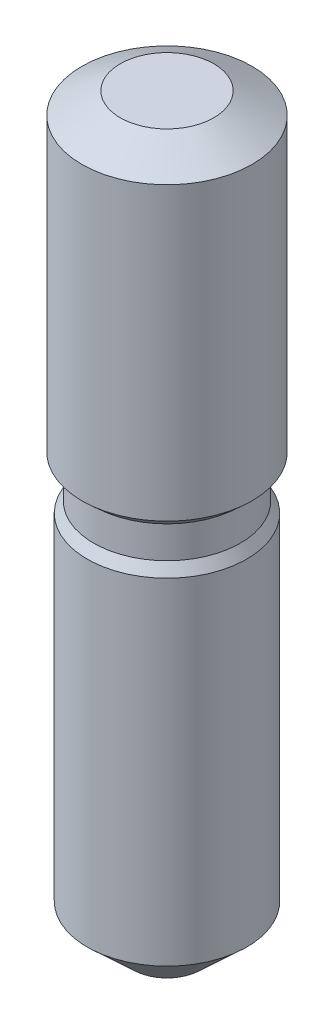
ISO-10303-21;
HEADER;
FILE_DESCRIPTION(('STEP AP214'),'2;1');
FILE_NAME('part.step','',(''),(''),'','','');
FILE_SCHEMA(('AUTOMOTIVE_DESIGN { 1 0 10303 214 1 1 1 1 }'));
ENDSEC;
DATA;
#1=APPLICATION_CONTEXT('core data for automotive mechanical design processes');
#2=APPLICATION_PROTOCOL_DEFINITION('international standard','automotive_design',2000,#1);
#3=PRODUCT_CONTEXT('',#1,'mechanical');
#4=PRODUCT('Part','Part','',(#3));
#5=PRODUCT_RELATED_PRODUCT_CATEGORY('part','',(#4));
#6=PRODUCT_DEFINITION_FORMATION('','',#4);
#7=PRODUCT_DEFINITION_CONTEXT('part definition',#1,'design');
#8=PRODUCT_DEFINITION('design','',#6,#7);
#9=PRODUCT_DEFINITION_SHAPE('','',#8);
#10=(LENGTH_UNIT() NAMED_UNIT(*) SI_UNIT(.MILLI.,.METRE.));
#11=(NAMED_UNIT(*) PLANE_ANGLE_UNIT() SI_UNIT($,.RADIAN.));
#12=(NAMED_UNIT(*) SI_UNIT($,.STERADIAN.) SOLID_ANGLE_UNIT());
#13=UNCERTAINTY_MEASURE_WITH_UNIT(LENGTH_MEASURE(1.E-05),#10,'distance_accuracy_value','');
#14=(GEOMETRIC_REPRESENTATION_CONTEXT(3) GLOBAL_UNCERTAINTY_ASSIGNED_CONTEXT((#13)) GLOBAL_UNIT_ASSIGNED_CONTEXT((#10,
#11,#12)) REPRESENTATION_CONTEXT('',''));
#15=CARTESIAN_POINT('',(0.,0.,0.));
#16=DIRECTION('',(0.,0.,1.));
#17=DIRECTION('',(1.,0.,0.));
#18=AXIS2_PLACEMENT_3D('',#15,#16,#17);
#19=CARTESIAN_POINT('',(0.,0.,0.));
#20=DIRECTION('',(0.,1.,0.));
#21=DIRECTION('',(0.,0.,1.));
#22=AXIS2_PLACEMENT_3D('',#19,#20,#21);
#23=PLANE('',#22);
#24=CARTESIAN_POINT('',(0.,0.,0.));
#25=DIRECTION('',(0.,-1.,0.));
#26=DIRECTION('',(0.,0.,-1.));
#27=AXIS2_PLACEMENT_3D('',#24,#25,#26);
#28=CIRCLE('',#27,4.4);
#29=CARTESIAN_POINT('',(0.,0.,-4.4));
#30=VERTEX_POINT('',#29);
#31=EDGE_CURVE('E10',#30,#30,#28,.T.);
#32=ORIENTED_EDGE('',*,*,#31,.F.);
#33=EDGE_LOOP('',(#32));
#34=FACE_BOUND('',#33,.T.);
#35=ADVANCED_FACE('F31',(#34),#23,.T.);
#36=CARTESIAN_POINT('',(0.,-2.,0.));
#37=DIRECTION('',(0.,-1.,0.));
#38=DIRECTION('',(0.,0.,-1.));
#39=AXIS2_PLACEMENT_3D('',#36,#37,#38);
#40=CONICAL_SURFACE('',#39,8.,1.06369782240256);
#41=ORIENTED_EDGE('',*,*,#31,.T.);
#42=EDGE_LOOP('',(#41));
#43=FACE_BOUND('',#42,.T.);
#44=CARTESIAN_POINT('',(0.,-2.,0.));
#45=DIRECTION('',(0.,-1.,0.));
#46=DIRECTION('',(0.,0.,-1.));
#47=AXIS2_PLACEMENT_3D('',#44,#45,#46);
#48=CIRCLE('',#47,8.);
#49=CARTESIAN_POINT('',(0.,-2.,-8.));
#50=VERTEX_POINT('',#49);
#51=EDGE_CURVE('E37',#50,#50,#48,.T.);
#52=ORIENTED_EDGE('',*,*,#51,.F.);
#53=EDGE_LOOP('',(#52));
#54=FACE_BOUND('',#53,.T.);
#55=ADVANCED_FACE('F79',(#43,#54),#40,.T.);
#56=CARTESIAN_POINT('',(0.,-74.,0.));
#57=DIRECTION('',(0.,-1.,0.));
#58=DIRECTION('',(0.,0.,-1.));
#59=AXIS2_PLACEMENT_3D('',#56,#57,#58);
#60=CYLINDRICAL_SURFACE('',#59,8.);
#61=ORIENTED_EDGE('',*,*,#51,.T.);
#62=EDGE_LOOP('',(#61));
#63=FACE_BOUND('',#62,.T.);
#64=CARTESIAN_POINT('',(0.,-29.4,0.));
#65=DIRECTION('',(0.,-1.,0.));
#66=DIRECTION('',(0.,0.,-1.));
#67=AXIS2_PLACEMENT_3D('',#64,#65,#66);
#68=CIRCLE('',#67,8.);
#69=CARTESIAN_POINT('',(0.,-29.4,-8.));
#70=VERTEX_POINT('',#69);
#71=EDGE_CURVE('E41',#70,#70,#68,.T.);
#72=ORIENTED_EDGE('',*,*,#71,.F.);
#73=EDGE_LOOP('',(#72));
#74=FACE_BOUND('',#73,.T.);
#75=ADVANCED_FACE('F84',(#63,#74),#60,.T.);
#76=CARTESIAN_POINT('',(0.,-30.4,0.));
#77=DIRECTION('',(0.,1.,0.));
#78=DIRECTION('',(0.,0.,1.));
#79=AXIS2_PLACEMENT_3D('',#76,#77,#78);
#80=CONICAL_SURFACE('',#79,6.9,0.832981266674431);
#81=ORIENTED_EDGE('',*,*,#71,.T.);
#82=EDGE_LOOP('',(#81));
#83=FACE_BOUND('',#82,.T.);
#84=CARTESIAN_POINT('',(0.,-30.4,0.));
#85=DIRECTION('',(0.,-1.,0.));
#86=DIRECTION('',(0.,0.,-1.));
#87=AXIS2_PLACEMENT_3D('',#84,#85,#86);
#88=CIRCLE('',#87,6.9);
#89=CARTESIAN_POINT('',(0.,-30.4,-6.9));
#90=VERTEX_POINT('',#89);
#91=EDGE_CURVE('E45',#90,#90,#88,.T.);
#92=ORIENTED_EDGE('',*,*,#91,.F.);
#93=EDGE_LOOP('',(#92));
#94=FACE_BOUND('',#93,.T.);
#95=ADVANCED_FACE('F88',(#83,#94),#80,.T.);
#96=CARTESIAN_POINT('',(0.,-74.,0.));
#97=DIRECTION('',(0.,-1.,0.));
#98=DIRECTION('',(0.,0.,-1.));
#99=AXIS2_PLACEMENT_3D('',#96,#97,#98);
#100=CYLINDRICAL_SURFACE('',#99,6.9);
#101=ORIENTED_EDGE('',*,*,#91,.T.);
#102=EDGE_LOOP('',(#101));
#103=FACE_BOUND('',#102,.T.);
#104=CARTESIAN_POINT('',(0.,-33.4,0.));
#105=DIRECTION('',(0.,-1.,0.));
#106=DIRECTION('',(0.,0.,-1.));
#107=AXIS2_PLACEMENT_3D('',#104,#105,#106);
#108=CIRCLE('',#107,6.9);
#109=CARTESIAN_POINT('',(0.,-33.4,-6.9));
#110=VERTEX_POINT('',#109);
#111=EDGE_CURVE('E50',#110,#110,#108,.T.);
#112=ORIENTED_EDGE('',*,*,#111,.F.);
#113=EDGE_LOOP('',(#112));
#114=FACE_BOUND('',#113,.T.);
#115=ADVANCED_FACE('F94',(#103,#114),#100,.T.);
#116=CARTESIAN_POINT('',(0.,-34.4,0.));
#117=DIRECTION('',(0.,-1.,0.));
#118=DIRECTION('',(0.,0.,-1.));
#119=AXIS2_PLACEMENT_3D('',#116,#117,#118);
#120=CONICAL_SURFACE('',#119,7.5,0.540419500270583);
#121=ORIENTED_EDGE('',*,*,#111,.T.);
#122=EDGE_LOOP('',(#121));
#123=FACE_BOUND('',#122,.T.);
#124=CARTESIAN_POINT('',(0.,-34.4,0.));
#125=DIRECTION('',(0.,-1.,0.));
#126=DIRECTION('',(0.,0.,-1.));
#127=AXIS2_PLACEMENT_3D('',#124,#125,#126);
#128=CIRCLE('',#127,7.5);
#129=CARTESIAN_POINT('',(0.,-34.4,-7.5));
#130=VERTEX_POINT('',#129);
#131=EDGE_CURVE('E53',#130,#130,#128,.T.);
#132=ORIENTED_EDGE('',*,*,#131,.F.);
#133=EDGE_LOOP('',(#132));
#134=FACE_BOUND('',#133,.T.);
#135=ADVANCED_FACE('F75',(#123,#134),#120,.T.);
#136=CARTESIAN_POINT('',(0.,-74.,0.));
#137=DIRECTION('',(0.,-1.,0.));
#138=DIRECTION('',(0.,0.,-1.));
#139=AXIS2_PLACEMENT_3D('',#136,#137,#138);
#140=CYLINDRICAL_SURFACE('',#139,7.5);
#141=ORIENTED_EDGE('',*,*,#131,.T.);
#142=EDGE_LOOP('',(#141));
#143=FACE_BOUND('',#142,.T.);
#144=CARTESIAN_POINT('',(0.,-66.,0.));
#145=DIRECTION('',(0.,-1.,0.));
#146=DIRECTION('',(0.,0.,-1.));
#147=AXIS2_PLACEMENT_3D('',#144,#145,#146);
#148=CIRCLE('',#147,7.5);
#149=CARTESIAN_POINT('',(0.,-66.,-7.5));
#150=VERTEX_POINT('',#149);
#151=EDGE_CURVE('E56',#150,#150,#148,.T.);
#152=ORIENTED_EDGE('',*,*,#151,.F.);
#153=EDGE_LOOP('',(#152));
#154=FACE_BOUND('',#153,.T.);
#155=ADVANCED_FACE('F67',(#143,#154),#140,.T.);
#156=CARTESIAN_POINT('',(0.,-70.,0.));
#157=DIRECTION('',(0.,1.,0.));
#158=DIRECTION('',(0.,0.,1.));
#159=AXIS2_PLACEMENT_3D('',#156,#157,#158);
#160=CONICAL_SURFACE('',#159,3.2,0.821527013910223);
#161=ORIENTED_EDGE('',*,*,#151,.T.);
#162=EDGE_LOOP('',(#161));
#163=FACE_BOUND('',#162,.T.);
#164=CARTESIAN_POINT('',(0.,-70.,0.));
#165=DIRECTION('',(0.,-1.,0.));
#166=DIRECTION('',(0.,0.,-1.));
#167=AXIS2_PLACEMENT_3D('',#164,#165,#166);
#168=CIRCLE('',#167,3.2);
#169=CARTESIAN_POINT('',(0.,-70.,-3.2));
#170=VERTEX_POINT('',#169);
#171=EDGE_CURVE('E59',#170,#170,#168,.T.);
#172=ORIENTED_EDGE('',*,*,#171,.F.);
#173=EDGE_LOOP('',(#172));
#174=FACE_BOUND('',#173,.T.);
#175=ADVANCED_FACE('F65',(#163,#174),#160,.T.);
#176=CARTESIAN_POINT('',(3.2,-70.,0.));
#177=DIRECTION('',(0.,-1.,0.));
#178=DIRECTION('',(0.,0.,-1.));
#179=AXIS2_PLACEMENT_3D('',#176,#177,#178);
#180=PLANE('',#179);
#181=ORIENTED_EDGE('',*,*,#171,.T.);
#182=EDGE_LOOP('',(#181));
#183=FACE_BOUND('',#182,.T.);
#184=ADVANCED_FACE('F63',(#183),#180,.T.);
#185=CLOSED_SHELL('',(#35,#55,#75,#95,#115,#135,#155,#175,#184));
#186=MANIFOLD_SOLID_BREP('B2',#185);
#187=ADVANCED_BREP_SHAPE_REPRESENTATION('',(#18,#186),#14);
#188=SHAPE_DEFINITION_REPRESENTATION(#9,#187);
ENDSEC;
END-ISO-10303-21;
